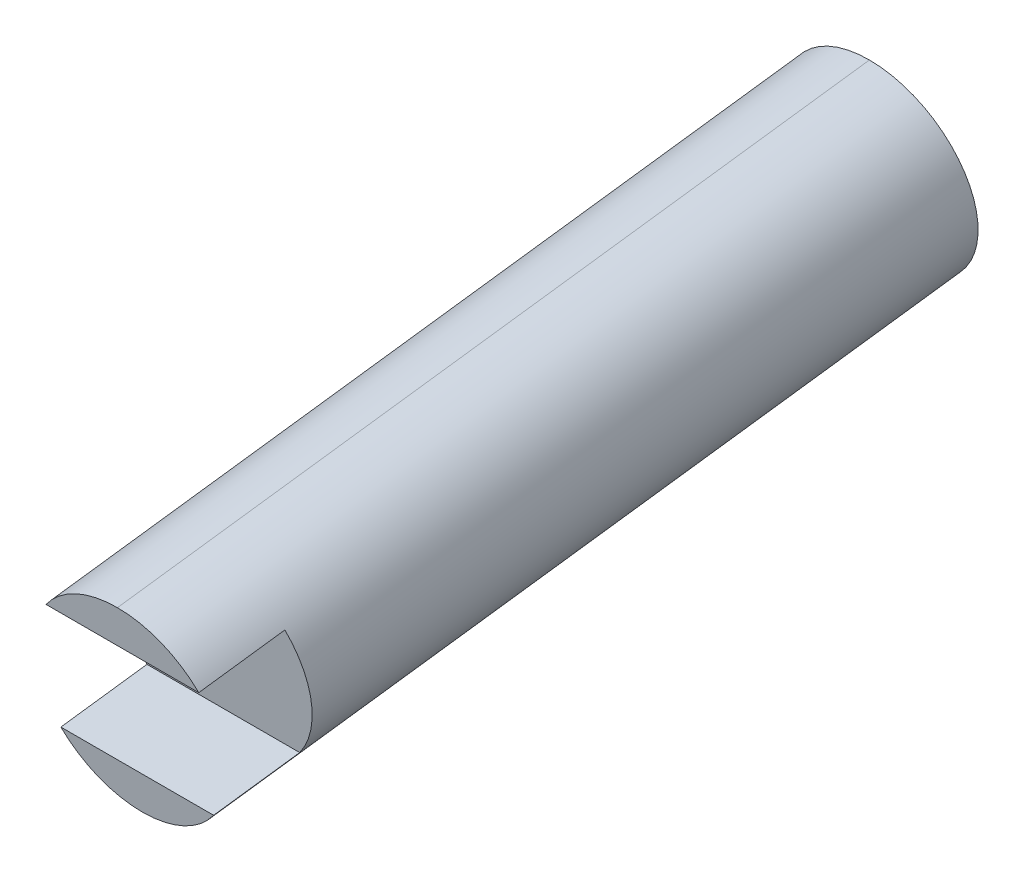
ISO-10303-21;
HEADER;
FILE_DESCRIPTION(('STEP AP214'),'2;1');
FILE_NAME('part.step','',(''),(''),'','','');
FILE_SCHEMA(('AUTOMOTIVE_DESIGN { 1 0 10303 214 1 1 1 1 }'));
ENDSEC;
DATA;
#1=APPLICATION_CONTEXT('core data for automotive mechanical design processes');
#2=APPLICATION_PROTOCOL_DEFINITION('international standard','automotive_design',2000,#1);
#3=PRODUCT_CONTEXT('',#1,'mechanical');
#4=PRODUCT('Part','Part','',(#3));
#5=PRODUCT_RELATED_PRODUCT_CATEGORY('part','',(#4));
#6=PRODUCT_DEFINITION_FORMATION('','',#4);
#7=PRODUCT_DEFINITION_CONTEXT('part definition',#1,'design');
#8=PRODUCT_DEFINITION('design','',#6,#7);
#9=PRODUCT_DEFINITION_SHAPE('','',#8);
#10=(LENGTH_UNIT() NAMED_UNIT(*) SI_UNIT(.MILLI.,.METRE.));
#11=(NAMED_UNIT(*) PLANE_ANGLE_UNIT() SI_UNIT($,.RADIAN.));
#12=(NAMED_UNIT(*) SI_UNIT($,.STERADIAN.) SOLID_ANGLE_UNIT());
#13=UNCERTAINTY_MEASURE_WITH_UNIT(LENGTH_MEASURE(1.E-05),#10,'distance_accuracy_value','');
#14=(GEOMETRIC_REPRESENTATION_CONTEXT(3) GLOBAL_UNCERTAINTY_ASSIGNED_CONTEXT((#13)) GLOBAL_UNIT_ASSIGNED_CONTEXT((#10,
#11,#12)) REPRESENTATION_CONTEXT('',''));
#15=CARTESIAN_POINT('',(0.,0.,0.));
#16=DIRECTION('',(0.,0.,1.));
#17=DIRECTION('',(1.,0.,0.));
#18=AXIS2_PLACEMENT_3D('',#15,#16,#17);
#19=CARTESIAN_POINT('',(35.525037901642,-0.321937839603,18.468415476143));
#20=DIRECTION('',(-8.68675176134282E-08,-0.129631601596013,0.991562225918094));
#21=DIRECTION('',(9.83749493956297E-09,-0.991562225918098,-0.129631601596013));
#22=AXIS2_PLACEMENT_3D('',#19,#20,#21);
#23=CYLINDRICAL_SURFACE('',#22,1.);
#24=DIRECTION('',(-8.68675176134282E-08,-0.129631601596012,0.991562225918094));
#25=VECTOR('',#24,1.);
#26=CARTESIAN_POINT('',(35.52503791148,-1.313500065521,18.338783874547));
#27=LINE('',#26,#25);
#28=CARTESIAN_POINT('',(35.525037835036,-1.427575874926,19.211358633354));
#29=VERTEX_POINT('',#28);
#30=CARTESIAN_POINT('',(35.525037329467,-2.182031796217,24.982250788197));
#31=VERTEX_POINT('',#30);
#32=EDGE_CURVE('E182',#29,#31,#27,.T.);
#33=ORIENTED_EDGE('',*,*,#32,.T.);
#34=CARTESIAN_POINT('',(35.52503731963,-1.190469570299,25.111882389794));
#35=DIRECTION('',(8.68675176134282E-08,0.129631601596013,-0.991562225918094));
#36=DIRECTION('',(9.83749493956297E-09,-0.991562225918098,-0.129631601596013));
#37=AXIS2_PLACEMENT_3D('',#34,#35,#36);
#38=CIRCLE('',#37,1.);
#39=CARTESIAN_POINT('',(35.525037309792,-0.198907344381,25.24151399139));
#40=VERTEX_POINT('',#39);
#41=EDGE_CURVE('E100',#40,#31,#38,.T.);
#42=ORIENTED_EDGE('',*,*,#41,.F.);
#43=DIRECTION('',(-8.68675176134282E-08,-0.129631601596012,0.991562225918094));
#44=VECTOR('',#43,1.);
#45=CARTESIAN_POINT('',(35.525037891805,0.669624386315,18.598047077739));
#46=LINE('',#45,#44);
#47=CARTESIAN_POINT('',(35.525037815361,0.55554857691,19.470621836547));
#48=VERTEX_POINT('',#47);
#49=EDGE_CURVE('E181',#48,#40,#46,.T.);
#50=ORIENTED_EDGE('',*,*,#49,.F.);
#51=CARTESIAN_POINT('',(35.525037825199,-0.436013649008,19.340990234951));
#52=DIRECTION('',(8.68675176134282E-08,0.129631601596013,-0.991562225918094));
#53=DIRECTION('',(9.83749493956297E-09,-0.991562225918098,-0.129631601596013));
#54=AXIS2_PLACEMENT_3D('',#51,#52,#53);
#55=CIRCLE('',#54,1.);
#56=EDGE_CURVE('E25',#48,#29,#55,.T.);
#57=ORIENTED_EDGE('',*,*,#56,.T.);
#58=EDGE_LOOP('',(#33,#42,#50,#57));
#59=FACE_BOUND('',#58,.T.);
#60=ADVANCED_FACE('F14',(#59),#23,.F.);
#61=CARTESIAN_POINT('',(35.525037825199,-0.436013649008,19.340990234951));
#62=DIRECTION('',(-8.68675176134282E-08,-0.129631601596013,0.991562225918094));
#63=DIRECTION('',(9.83749493956297E-09,-0.991562225918098,-0.129631601596013));
#64=AXIS2_PLACEMENT_3D('',#61,#62,#63);
#65=CYLINDRICAL_SURFACE('',#64,1.375);
#66=DIRECTION('',(-8.68675176134282E-08,-0.129631601596012,0.991562225918094));
#67=VECTOR('',#66,1.);
#68=CARTESIAN_POINT('',(35.525037838725,-1.799411709645,19.162746782756));
#69=LINE('',#68,#67);
#70=CARTESIAN_POINT('',(35.525037838725,-1.799411709645,19.162746782756));
#71=VERTEX_POINT('',#70);
#72=CARTESIAN_POINT('',(35.525036890132,-3.214988799077,29.990606289781));
#73=VERTEX_POINT('',#72);
#74=EDGE_CURVE('E125',#71,#73,#69,.T.);
#75=ORIENTED_EDGE('',*,*,#74,.T.);
#76=CARTESIAN_POINT('',(35.525036876606,-1.85159073844,30.168849741976));
#77=DIRECTION('',(8.68675176134282E-08,0.129631601596013,-0.991562225918094));
#78=DIRECTION('',(9.83749493956297E-09,-0.991562225918098,-0.129631601596013));
#79=AXIS2_PLACEMENT_3D('',#76,#77,#78);
#80=CIRCLE('',#79,1.375);
#81=CARTESIAN_POINT('',(34.425036884721,-2.669629573166,30.061903574508));
#82=VERTEX_POINT('',#81);
#83=EDGE_CURVE('E119',#73,#82,#80,.T.);
#84=ORIENTED_EDGE('',*,*,#83,.T.);
#85=DIRECTION('',(-8.68675176134282E-08,-0.129631601596012,0.991562225918094));
#86=VECTOR('',#85,1.);
#87=CARTESIAN_POINT('',(34.425037833315,-1.254052483733,19.234044067483));
#88=LINE('',#87,#86);
#89=CARTESIAN_POINT('',(34.425036993306,-2.50759007117,28.822450792111));
#90=VERTEX_POINT('',#89);
#91=EDGE_CURVE('E122',#90,#82,#88,.T.);
#92=ORIENTED_EDGE('',*,*,#91,.F.);
#93=CARTESIAN_POINT('',(35.52503698519,-1.689551236445,28.929396959578));
#94=DIRECTION('',(-8.68675176134282E-08,-0.129631601596013,0.991562225918094));
#95=DIRECTION('',(9.83749493956297E-09,-0.991562225918098,-0.129631601596013));
#96=AXIS2_PLACEMENT_3D('',#93,#94,#95);
#97=CIRCLE('',#96,1.375);
#98=CARTESIAN_POINT('',(34.425036977074,-0.871512398405,29.036342934745));
#99=VERTEX_POINT('',#98);
#100=EDGE_CURVE('E79',#99,#90,#97,.T.);
#101=ORIENTED_EDGE('',*,*,#100,.F.);
#102=DIRECTION('',(8.68675176134282E-08,0.129631601596012,-0.991562225918094));
#103=VECTOR('',#102,1.);
#104=CARTESIAN_POINT('',(34.425037817083,0.382025189032,19.447936210117));
#105=LINE('',#104,#103);
#106=CARTESIAN_POINT('',(34.42503686849,-1.033551900401,30.275795717142));
#107=VERTEX_POINT('',#106);
#108=EDGE_CURVE('E165',#107,#99,#105,.T.);
#109=ORIENTED_EDGE('',*,*,#108,.F.);
#110=CARTESIAN_POINT('',(35.525036876606,-1.85159073844,30.168849741976));
#111=DIRECTION('',(8.68675176134282E-08,0.129631601596013,-0.991562225918094));
#112=DIRECTION('',(9.83749493956297E-09,-0.991562225918098,-0.129631601596013));
#113=AXIS2_PLACEMENT_3D('',#110,#111,#112);
#114=CIRCLE('',#113,1.375);
#115=CARTESIAN_POINT('',(35.525036863079,-0.488192677803,30.347093194171));
#116=VERTEX_POINT('',#115);
#117=EDGE_CURVE('E169',#107,#116,#114,.T.);
#118=ORIENTED_EDGE('',*,*,#117,.T.);
#119=DIRECTION('',(-8.68675176134282E-08,-0.129631601596012,0.991562225918094));
#120=VECTOR('',#119,1.);
#121=CARTESIAN_POINT('',(35.525037811672,0.92738441163,19.519233687146));
#122=LINE('',#121,#120);
#123=CARTESIAN_POINT('',(35.525037811672,0.92738441163,19.519233687146));
#124=VERTEX_POINT('',#123);
#125=EDGE_CURVE('E160',#124,#116,#122,.T.);
#126=ORIENTED_EDGE('',*,*,#125,.F.);
#127=CARTESIAN_POINT('',(35.525037825199,-0.436013649008,19.340990234951));
#128=DIRECTION('',(-8.68675176134282E-08,-0.129631601596013,0.991562225918094));
#129=DIRECTION('',(9.83749493956297E-09,-0.991562225918098,-0.129631601596013));
#130=AXIS2_PLACEMENT_3D('',#127,#128,#129);
#131=CIRCLE('',#130,1.375);
#132=EDGE_CURVE('E9',#124,#71,#131,.T.);
#133=ORIENTED_EDGE('',*,*,#132,.T.);
#134=EDGE_LOOP('',(#75,#84,#92,#101,#109,#118,#126,#133));
#135=FACE_BOUND('',#134,.T.);
#136=ADVANCED_FACE('F16',(#135),#65,.T.);
#137=CARTESIAN_POINT('',(35.525037825199,-0.436013649008,19.340990234951));
#138=DIRECTION('',(8.68675176134282E-08,0.129631601596012,-0.991562225918094));
#139=DIRECTION('',(-1.,0.,-8.76067233531377E-08));
#140=AXIS2_PLACEMENT_3D('',#137,#138,#139);
#141=PLANE('',#140);
#142=ORIENTED_EDGE('',*,*,#132,.F.);
#143=CARTESIAN_POINT('',(35.525037825199,-0.436013649008,19.340990234951));
#144=DIRECTION('',(-8.68675176134282E-08,-0.129631601596013,0.991562225918094));
#145=DIRECTION('',(9.83749493956297E-09,-0.991562225918098,-0.129631601596013));
#146=AXIS2_PLACEMENT_3D('',#143,#144,#145);
#147=CIRCLE('',#146,1.375);
#148=EDGE_CURVE('E155',#71,#124,#147,.T.);
#149=ORIENTED_EDGE('',*,*,#148,.F.);
#150=EDGE_LOOP('',(#142,#149));
#151=FACE_BOUND('',#150,.T.);
#152=ORIENTED_EDGE('',*,*,#56,.F.);
#153=CARTESIAN_POINT('',(35.525037825199,-0.436013649008,19.340990234951));
#154=DIRECTION('',(8.68675176134282E-08,0.129631601596013,-0.991562225918094));
#155=DIRECTION('',(9.83749493956297E-09,-0.991562225918098,-0.129631601596013));
#156=AXIS2_PLACEMENT_3D('',#153,#154,#155);
#157=CIRCLE('',#156,1.);
#158=EDGE_CURVE('E177',#29,#48,#157,.T.);
#159=ORIENTED_EDGE('',*,*,#158,.F.);
#160=EDGE_LOOP('',(#152,#159));
#161=FACE_BOUND('',#160,.T.);
#162=ADVANCED_FACE('F207',(#151,#161),#141,.T.);
#163=CARTESIAN_POINT('',(35.525037825199,-0.436013649008,19.340990234951));
#164=DIRECTION('',(-8.68675176134282E-08,-0.129631601596013,0.991562225918094));
#165=DIRECTION('',(9.83749493956297E-09,-0.991562225918098,-0.129631601596013));
#166=AXIS2_PLACEMENT_3D('',#163,#164,#165);
#167=CYLINDRICAL_SURFACE('',#166,1.375);
#168=CARTESIAN_POINT('',(35.525036876606,-1.85159073844,30.168849741976));
#169=DIRECTION('',(8.68675176134282E-08,0.129631601596013,-0.991562225918094));
#170=DIRECTION('',(9.83749493956297E-09,-0.991562225918098,-0.129631601596013));
#171=AXIS2_PLACEMENT_3D('',#168,#169,#170);
#172=CIRCLE('',#171,1.375);
#173=CARTESIAN_POINT('',(36.62503686849,-1.033551903715,30.275795909444));
#174=VERTEX_POINT('',#173);
#175=EDGE_CURVE('E53',#116,#174,#172,.T.);
#176=ORIENTED_EDGE('',*,*,#175,.T.);
#177=DIRECTION('',(-8.68675176134282E-08,-0.129631601596012,0.991562225918094));
#178=VECTOR('',#177,1.);
#179=CARTESIAN_POINT('',(36.625037817083,0.382025185718,19.447936402419));
#180=LINE('',#179,#178);
#181=CARTESIAN_POINT('',(36.625036977074,-0.871512401719,29.036343127046));
#182=VERTEX_POINT('',#181);
#183=EDGE_CURVE('E148',#182,#174,#180,.T.);
#184=ORIENTED_EDGE('',*,*,#183,.F.);
#185=CARTESIAN_POINT('',(35.52503698519,-1.689551236445,28.929396959578));
#186=DIRECTION('',(-8.68675176134282E-08,-0.129631601596013,0.991562225918094));
#187=DIRECTION('',(9.83749493956297E-09,-0.991562225918098,-0.129631601596013));
#188=AXIS2_PLACEMENT_3D('',#185,#186,#187);
#189=CIRCLE('',#188,1.375);
#190=CARTESIAN_POINT('',(36.625036993306,-2.507590074484,28.822450984412));
#191=VERTEX_POINT('',#190);
#192=EDGE_CURVE('E67',#191,#182,#189,.T.);
#193=ORIENTED_EDGE('',*,*,#192,.F.);
#194=DIRECTION('',(8.68675176134282E-08,0.129631601596012,-0.991562225918094));
#195=VECTOR('',#194,1.);
#196=CARTESIAN_POINT('',(36.625037833315,-1.254052487047,19.234044259785));
#197=LINE('',#196,#195);
#198=CARTESIAN_POINT('',(36.625036884721,-2.669629576479,30.06190376681));
#199=VERTEX_POINT('',#198);
#200=EDGE_CURVE('E145',#199,#191,#197,.T.);
#201=ORIENTED_EDGE('',*,*,#200,.F.);
#202=CARTESIAN_POINT('',(35.525036876606,-1.85159073844,30.168849741976));
#203=DIRECTION('',(8.68675176134282E-08,0.129631601596013,-0.991562225918094));
#204=DIRECTION('',(9.83749493956297E-09,-0.991562225918098,-0.129631601596013));
#205=AXIS2_PLACEMENT_3D('',#202,#203,#204);
#206=CIRCLE('',#205,1.375);
#207=EDGE_CURVE('E18',#199,#73,#206,.T.);
#208=ORIENTED_EDGE('',*,*,#207,.T.);
#209=ORIENTED_EDGE('',*,*,#74,.F.);
#210=ORIENTED_EDGE('',*,*,#148,.T.);
#211=ORIENTED_EDGE('',*,*,#125,.T.);
#212=EDGE_LOOP('',(#176,#184,#193,#201,#208,#209,#210,#211));
#213=FACE_BOUND('',#212,.T.);
#214=ADVANCED_FACE('F209',(#213),#167,.T.);
#215=CARTESIAN_POINT('',(35.52503731963,-1.190469570299,25.111882389794));
#216=DIRECTION('',(8.68675176134282E-08,0.129631601596012,-0.991562225918094));
#217=DIRECTION('',(-1.,0.,-8.76067233531377E-08));
#218=AXIS2_PLACEMENT_3D('',#215,#216,#217);
#219=PLANE('',#218);
#220=ORIENTED_EDGE('',*,*,#41,.T.);
#221=CARTESIAN_POINT('',(35.52503731963,-1.190469570299,25.111882389794));
#222=DIRECTION('',(8.68675176134282E-08,0.129631601596013,-0.991562225918094));
#223=DIRECTION('',(9.83749493956297E-09,-0.991562225918098,-0.129631601596013));
#224=AXIS2_PLACEMENT_3D('',#221,#222,#223);
#225=CIRCLE('',#224,1.);
#226=EDGE_CURVE('E191',#31,#40,#225,.T.);
#227=ORIENTED_EDGE('',*,*,#226,.T.);
#228=EDGE_LOOP('',(#220,#227));
#229=FACE_BOUND('',#228,.T.);
#230=ADVANCED_FACE('F201',(#229),#219,.T.);
#231=CARTESIAN_POINT('',(35.525037901642,-0.321937839603,18.468415476143));
#232=DIRECTION('',(-8.68675176134282E-08,-0.129631601596013,0.991562225918094));
#233=DIRECTION('',(9.83749493956297E-09,-0.991562225918098,-0.129631601596013));
#234=AXIS2_PLACEMENT_3D('',#231,#232,#233);
#235=CYLINDRICAL_SURFACE('',#234,1.);
#236=ORIENTED_EDGE('',*,*,#226,.F.);
#237=ORIENTED_EDGE('',*,*,#32,.F.);
#238=ORIENTED_EDGE('',*,*,#158,.T.);
#239=ORIENTED_EDGE('',*,*,#49,.T.);
#240=EDGE_LOOP('',(#236,#237,#238,#239));
#241=FACE_BOUND('',#240,.T.);
#242=ADVANCED_FACE('F204',(#241),#235,.F.);
#243=CARTESIAN_POINT('',(35.525036876606,-1.85159073844,30.168849741976));
#244=DIRECTION('',(8.68675176134282E-08,0.129631601596012,-0.991562225918094));
#245=DIRECTION('',(-1.,0.,-8.76067233531377E-08));
#246=AXIS2_PLACEMENT_3D('',#243,#244,#245);
#247=PLANE('',#246);
#248=ORIENTED_EDGE('',*,*,#175,.F.);
#249=ORIENTED_EDGE('',*,*,#117,.F.);
#250=DIRECTION('',(-1.,1.506287055199E-09,-8.74097993494497E-08));
#251=VECTOR('',#250,1.);
#252=CARTESIAN_POINT('',(36.07503686849,-1.033551902886,30.275795861368));
#253=LINE('',#252,#251);
#254=EDGE_CURVE('E151',#174,#107,#253,.T.);
#255=ORIENTED_EDGE('',*,*,#254,.F.);
#256=EDGE_LOOP('',(#248,#249,#255));
#257=FACE_BOUND('',#256,.T.);
#258=ADVANCED_FACE('F225',(#257),#247,.F.);
#259=CARTESIAN_POINT('',(35.525036876606,-1.85159073844,30.168849741976));
#260=DIRECTION('',(8.68675176134282E-08,0.129631601596012,-0.991562225918094));
#261=DIRECTION('',(-1.,0.,-8.76067233531377E-08));
#262=AXIS2_PLACEMENT_3D('',#259,#260,#261);
#263=PLANE('',#262);
#264=ORIENTED_EDGE('',*,*,#83,.F.);
#265=ORIENTED_EDGE('',*,*,#207,.F.);
#266=DIRECTION('',(1.,-1.506287055199E-09,8.74097993494497E-08));
#267=VECTOR('',#266,1.);
#268=CARTESIAN_POINT('',(34.975036884721,-2.669629573994,30.061903622583));
#269=LINE('',#268,#267);
#270=EDGE_CURVE('E131',#82,#199,#269,.T.);
#271=ORIENTED_EDGE('',*,*,#270,.F.);
#272=EDGE_LOOP('',(#264,#265,#271));
#273=FACE_BOUND('',#272,.T.);
#274=ADVANCED_FACE('F132',(#273),#263,.F.);
#275=CARTESIAN_POINT('',(35.52503698519,-1.689551236445,28.929396959578));
#276=DIRECTION('',(-8.68675176134282E-08,-0.129631601596012,0.991562225918094));
#277=DIRECTION('',(-0.999999999999775,6.70110656228141E-07,0.));
#278=AXIS2_PLACEMENT_3D('',#275,#276,#277);
#279=PLANE('',#278);
#280=DIRECTION('',(1.,-1.506287055199E-09,8.74097993494497E-08));
#281=VECTOR('',#280,1.);
#282=CARTESIAN_POINT('',(36.900036993306,-2.507590074898,28.82245100845));
#283=LINE('',#282,#281);
#284=EDGE_CURVE('E139',#90,#191,#283,.T.);
#285=ORIENTED_EDGE('',*,*,#284,.T.);
#286=ORIENTED_EDGE('',*,*,#192,.T.);
#287=DIRECTION('',(-1.,1.506287055199E-09,-8.74097993494497E-08));
#288=VECTOR('',#287,1.);
#289=CARTESIAN_POINT('',(34.150036977074,-0.871512397991,29.036342910707));
#290=LINE('',#289,#288);
#291=EDGE_CURVE('E152',#182,#99,#290,.T.);
#292=ORIENTED_EDGE('',*,*,#291,.T.);
#293=ORIENTED_EDGE('',*,*,#100,.T.);
#294=EDGE_LOOP('',(#285,#286,#292,#293));
#295=FACE_BOUND('',#294,.T.);
#296=ADVANCED_FACE('F228',(#295),#279,.T.);
#297=CARTESIAN_POINT('',(34.425036884721,-2.669629573166,30.061903574508));
#298=DIRECTION('',(9.83749493956297E-09,-0.991562225918098,-0.129631601596013));
#299=DIRECTION('',(0.,0.129631601596013,-0.991562225918098));
#300=AXIS2_PLACEMENT_3D('',#297,#298,#299);
#301=PLANE('',#300);
#302=ORIENTED_EDGE('',*,*,#200,.T.);
#303=ORIENTED_EDGE('',*,*,#284,.F.);
#304=ORIENTED_EDGE('',*,*,#91,.T.);
#305=ORIENTED_EDGE('',*,*,#270,.T.);
#306=EDGE_LOOP('',(#302,#303,#304,#305));
#307=FACE_BOUND('',#306,.T.);
#308=ADVANCED_FACE('F138',(#307),#301,.F.);
#309=CARTESIAN_POINT('',(36.62503686849,-1.033551903715,30.275795909444));
#310=DIRECTION('',(-9.83749493956297E-09,0.991562225918098,0.129631601596013));
#311=DIRECTION('',(1.,0.,7.58880922432846E-08));
#312=AXIS2_PLACEMENT_3D('',#309,#310,#311);
#313=PLANE('',#312);
#314=ORIENTED_EDGE('',*,*,#108,.T.);
#315=ORIENTED_EDGE('',*,*,#291,.F.);
#316=ORIENTED_EDGE('',*,*,#183,.T.);
#317=ORIENTED_EDGE('',*,*,#254,.T.);
#318=EDGE_LOOP('',(#314,#315,#316,#317));
#319=FACE_BOUND('',#318,.T.);
#320=ADVANCED_FACE('F229',(#319),#313,.F.);
#321=CLOSED_SHELL('',(#60,#136,#162,#214,#230,#242,#258,#274,#296,#308,#320));
#322=MANIFOLD_SOLID_BREP('B1',#321);
#323=ADVANCED_BREP_SHAPE_REPRESENTATION('',(#18,#322),#14);
#324=SHAPE_DEFINITION_REPRESENTATION(#9,#323);
ENDSEC;
END-ISO-10303-21;
